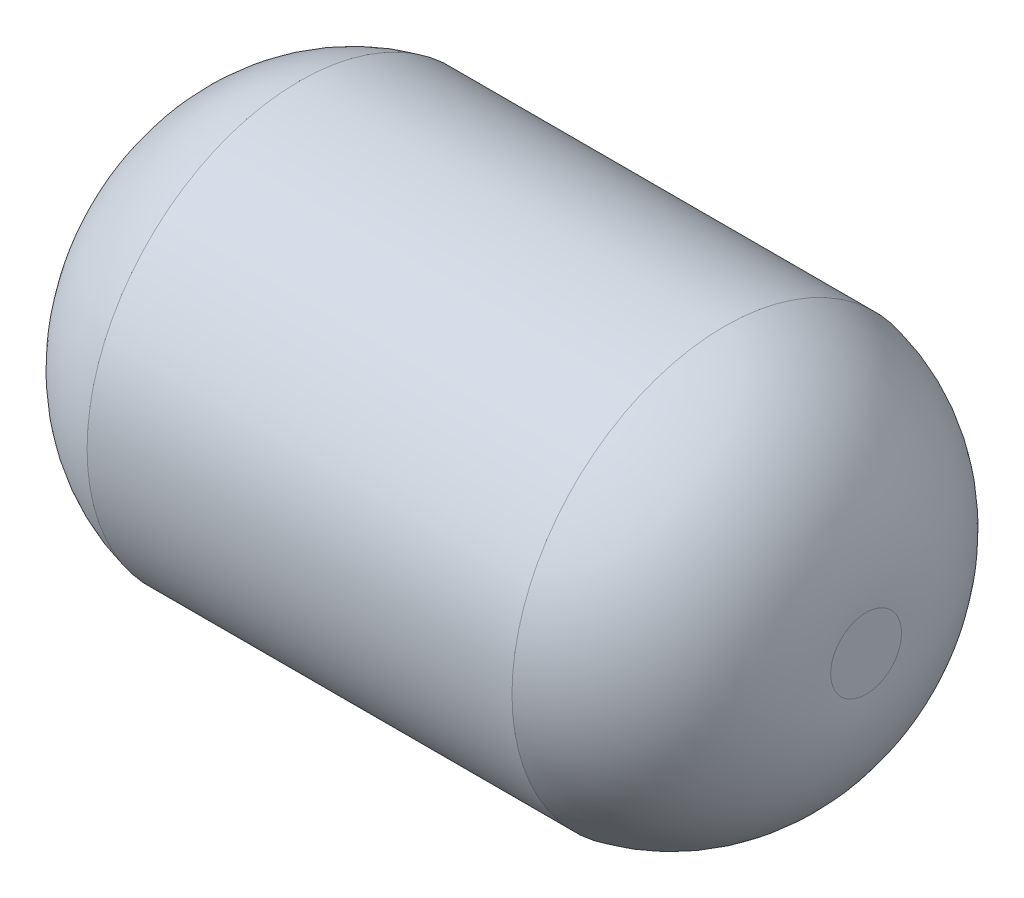
ISO-10303-21;
HEADER;
FILE_DESCRIPTION(('STEP AP214'),'2;1');
FILE_NAME('part.step','',(''),(''),'','','');
FILE_SCHEMA(('AUTOMOTIVE_DESIGN { 1 0 10303 214 1 1 1 1 }'));
ENDSEC;
DATA;
#1=APPLICATION_CONTEXT('core data for automotive mechanical design processes');
#2=APPLICATION_PROTOCOL_DEFINITION('international standard','automotive_design',2000,#1);
#3=PRODUCT_CONTEXT('',#1,'mechanical');
#4=PRODUCT('Part','Part','',(#3));
#5=PRODUCT_RELATED_PRODUCT_CATEGORY('part','',(#4));
#6=PRODUCT_DEFINITION_FORMATION('','',#4);
#7=PRODUCT_DEFINITION_CONTEXT('part definition',#1,'design');
#8=PRODUCT_DEFINITION('design','',#6,#7);
#9=PRODUCT_DEFINITION_SHAPE('','',#8);
#10=(LENGTH_UNIT() NAMED_UNIT(*) SI_UNIT(.MILLI.,.METRE.));
#11=(NAMED_UNIT(*) PLANE_ANGLE_UNIT() SI_UNIT($,.RADIAN.));
#12=(NAMED_UNIT(*) SI_UNIT($,.STERADIAN.) SOLID_ANGLE_UNIT());
#13=UNCERTAINTY_MEASURE_WITH_UNIT(LENGTH_MEASURE(1.E-05),#10,'distance_accuracy_value','');
#14=(GEOMETRIC_REPRESENTATION_CONTEXT(3) GLOBAL_UNCERTAINTY_ASSIGNED_CONTEXT((#13)) GLOBAL_UNIT_ASSIGNED_CONTEXT((#10,
#11,#12)) REPRESENTATION_CONTEXT('',''));
#15=CARTESIAN_POINT('',(0.,0.,0.));
#16=DIRECTION('',(0.,0.,1.));
#17=DIRECTION('',(1.,0.,0.));
#18=AXIS2_PLACEMENT_3D('',#15,#16,#17);
#19=CARTESIAN_POINT('',(0.,0.,0.));
#20=DIRECTION('',(-1.,0.,0.));
#21=DIRECTION('',(0.,0.,1.));
#22=AXIS2_PLACEMENT_3D('',#19,#20,#21);
#23=CYLINDRICAL_SURFACE('',#22,60.);
#24=CARTESIAN_POINT('',(59.9999999999999,0.,0.));
#25=DIRECTION('',(-1.,0.,0.));
#26=DIRECTION('',(0.,0.,1.));
#27=AXIS2_PLACEMENT_3D('',#24,#25,#26);
#28=CIRCLE('',#27,60.);
#29=CARTESIAN_POINT('',(59.9999999999999,0.,60.));
#30=VERTEX_POINT('',#29);
#31=EDGE_CURVE('E48',#30,#30,#28,.T.);
#32=ORIENTED_EDGE('',*,*,#31,.T.);
#33=EDGE_LOOP('',(#32));
#34=FACE_BOUND('',#33,.T.);
#35=CARTESIAN_POINT('',(-59.9999999999999,0.,0.));
#36=DIRECTION('',(-1.,0.,0.));
#37=DIRECTION('',(0.,0.,1.));
#38=AXIS2_PLACEMENT_3D('',#35,#36,#37);
#39=CIRCLE('',#38,60.);
#40=CARTESIAN_POINT('',(-59.9999999999999,0.,60.));
#41=VERTEX_POINT('',#40);
#42=EDGE_CURVE('E62',#41,#41,#39,.T.);
#43=ORIENTED_EDGE('',*,*,#42,.F.);
#44=EDGE_LOOP('',(#43));
#45=FACE_BOUND('',#44,.T.);
#46=ADVANCED_FACE('F33',(#34,#45),#23,.T.);
#47=CARTESIAN_POINT('',(100.,0.,0.));
#48=DIRECTION('',(-1.,0.,0.));
#49=DIRECTION('',(0.,0.,1.));
#50=AXIS2_PLACEMENT_3D('',#47,#48,#49);
#51=PLANE('',#50);
#52=CARTESIAN_POINT('',(100.,0.,0.));
#53=DIRECTION('',(-1.,0.,0.));
#54=DIRECTION('',(0.,0.,1.));
#55=AXIS2_PLACEMENT_3D('',#52,#53,#54);
#56=CIRCLE('',#55,9.99999999999979);
#57=CARTESIAN_POINT('',(100.,0.,9.99999999999979));
#58=VERTEX_POINT('',#57);
#59=EDGE_CURVE('E44',#58,#58,#56,.T.);
#60=ORIENTED_EDGE('',*,*,#59,.F.);
#61=EDGE_LOOP('',(#60));
#62=FACE_BOUND('',#61,.T.);
#63=ADVANCED_FACE('F70',(#62),#51,.F.);
#64=CARTESIAN_POINT('',(49.7390987972272,0.,0.));
#65=DIRECTION('',(-1.,0.,0.));
#66=DIRECTION('',(0.,0.,1.));
#67=AXIS2_PLACEMENT_3D('',#64,#65,#66);
#68=DEGENERATE_TOROIDAL_SURFACE('',#67,10.7912790377818,50.2671295403917,.T.);
#69=ORIENTED_EDGE('',*,*,#31,.F.);
#70=EDGE_LOOP('',(#69));
#71=FACE_BOUND('',#70,.T.);
#72=ORIENTED_EDGE('',*,*,#59,.T.);
#73=EDGE_LOOP('',(#72));
#74=FACE_BOUND('',#73,.T.);
#75=ADVANCED_FACE('F75',(#71,#74),#68,.T.);
#76=CARTESIAN_POINT('',(-100.,0.,0.));
#77=DIRECTION('',(1.,0.,0.));
#78=DIRECTION('',(0.,0.,1.));
#79=AXIS2_PLACEMENT_3D('',#76,#77,#78);
#80=PLANE('',#79);
#81=CARTESIAN_POINT('',(-100.,0.,0.));
#82=DIRECTION('',(-1.,0.,0.));
#83=DIRECTION('',(0.,0.,1.));
#84=AXIS2_PLACEMENT_3D('',#81,#82,#83);
#85=CIRCLE('',#84,9.99999999999979);
#86=CARTESIAN_POINT('',(-100.,0.,9.99999999999979));
#87=VERTEX_POINT('',#86);
#88=EDGE_CURVE('E59',#87,#87,#85,.T.);
#89=ORIENTED_EDGE('',*,*,#88,.T.);
#90=EDGE_LOOP('',(#89));
#91=FACE_BOUND('',#90,.T.);
#92=ADVANCED_FACE('F82',(#91),#80,.F.);
#93=CARTESIAN_POINT('',(-49.7390987972272,0.,0.));
#94=DIRECTION('',(1.,0.,0.));
#95=DIRECTION('',(0.,0.,1.));
#96=AXIS2_PLACEMENT_3D('',#93,#94,#95);
#97=DEGENERATE_TOROIDAL_SURFACE('',#96,10.7912790377818,50.2671295403917,.T.);
#98=ORIENTED_EDGE('',*,*,#42,.T.);
#99=EDGE_LOOP('',(#98));
#100=FACE_BOUND('',#99,.T.);
#101=ORIENTED_EDGE('',*,*,#88,.F.);
#102=EDGE_LOOP('',(#101));
#103=FACE_BOUND('',#102,.T.);
#104=ADVANCED_FACE('F66',(#100,#103),#97,.T.);
#105=CLOSED_SHELL('',(#46,#63,#75,#92,#104));
#106=CARTESIAN_POINT('',(99.,0.,0.));
#107=DIRECTION('',(-1.,0.,0.));
#108=DIRECTION('',(0.,0.,1.));
#109=AXIS2_PLACEMENT_3D('',#106,#107,#108);
#110=PLANE('',#109);
#111=CARTESIAN_POINT('',(99.,0.,0.));
#112=DIRECTION('',(-1.,0.,0.));
#113=DIRECTION('',(0.,0.,1.));
#114=AXIS2_PLACEMENT_3D('',#111,#112,#113);
#115=CIRCLE('',#114,10.0079107716416);
#116=CARTESIAN_POINT('',(99.,0.,10.0079107716416));
#117=VERTEX_POINT('',#116);
#118=EDGE_CURVE('E40',#117,#117,#115,.T.);
#119=ORIENTED_EDGE('',*,*,#118,.T.);
#120=EDGE_LOOP('',(#119));
#121=FACE_BOUND('',#120,.T.);
#122=ADVANCED_FACE('F94',(#121),#110,.T.);
#123=CARTESIAN_POINT('',(49.7390987972272,0.,0.));
#124=DIRECTION('',(-1.,0.,0.));
#125=DIRECTION('',(0.,0.,1.));
#126=AXIS2_PLACEMENT_3D('',#123,#124,#125);
#127=DEGENERATE_TOROIDAL_SURFACE('',#126,10.7912790377818,49.2671295403917,.T.);
#128=CARTESIAN_POINT('',(59.8963265851975,0.,0.));
#129=DIRECTION('',(-1.,0.,0.));
#130=DIRECTION('',(0.,0.,1.));
#131=AXIS2_PLACEMENT_3D('',#128,#129,#130);
#132=CIRCLE('',#131,59.);
#133=CARTESIAN_POINT('',(59.8963265851975,0.,59.));
#134=VERTEX_POINT('',#133);
#135=EDGE_CURVE('E10',#134,#134,#132,.T.);
#136=ORIENTED_EDGE('',*,*,#135,.T.);
#137=EDGE_LOOP('',(#136));
#138=FACE_BOUND('',#137,.T.);
#139=ORIENTED_EDGE('',*,*,#118,.F.);
#140=EDGE_LOOP('',(#139));
#141=FACE_BOUND('',#140,.T.);
#142=ADVANCED_FACE('F97',(#138,#141),#127,.F.);
#143=CARTESIAN_POINT('',(0.,0.,0.));
#144=DIRECTION('',(-1.,0.,0.));
#145=DIRECTION('',(0.,0.,1.));
#146=AXIS2_PLACEMENT_3D('',#143,#144,#145);
#147=CYLINDRICAL_SURFACE('',#146,59.);
#148=ORIENTED_EDGE('',*,*,#135,.F.);
#149=EDGE_LOOP('',(#148));
#150=FACE_BOUND('',#149,.T.);
#151=CARTESIAN_POINT('',(-59.8963265851975,0.,0.));
#152=DIRECTION('',(-1.,0.,0.));
#153=DIRECTION('',(0.,0.,1.));
#154=AXIS2_PLACEMENT_3D('',#151,#152,#153);
#155=CIRCLE('',#154,59.);
#156=CARTESIAN_POINT('',(-59.8963265851975,0.,59.));
#157=VERTEX_POINT('',#156);
#158=EDGE_CURVE('E53',#157,#157,#155,.T.);
#159=ORIENTED_EDGE('',*,*,#158,.T.);
#160=EDGE_LOOP('',(#159));
#161=FACE_BOUND('',#160,.T.);
#162=ADVANCED_FACE('F100',(#150,#161),#147,.F.);
#163=CARTESIAN_POINT('',(-99.,0.,0.));
#164=DIRECTION('',(1.,0.,0.));
#165=DIRECTION('',(0.,0.,1.));
#166=AXIS2_PLACEMENT_3D('',#163,#164,#165);
#167=PLANE('',#166);
#168=CARTESIAN_POINT('',(-99.,0.,0.));
#169=DIRECTION('',(-1.,0.,0.));
#170=DIRECTION('',(0.,0.,1.));
#171=AXIS2_PLACEMENT_3D('',#168,#169,#170);
#172=CIRCLE('',#171,10.0079107716416);
#173=CARTESIAN_POINT('',(-99.,0.,10.0079107716416));
#174=VERTEX_POINT('',#173);
#175=EDGE_CURVE('E56',#174,#174,#172,.T.);
#176=ORIENTED_EDGE('',*,*,#175,.F.);
#177=EDGE_LOOP('',(#176));
#178=FACE_BOUND('',#177,.T.);
#179=ADVANCED_FACE('F102',(#178),#167,.T.);
#180=CARTESIAN_POINT('',(-49.7390987972272,0.,0.));
#181=DIRECTION('',(1.,0.,0.));
#182=DIRECTION('',(0.,0.,1.));
#183=AXIS2_PLACEMENT_3D('',#180,#181,#182);
#184=DEGENERATE_TOROIDAL_SURFACE('',#183,10.7912790377818,49.2671295403917,.T.);
#185=ORIENTED_EDGE('',*,*,#158,.F.);
#186=EDGE_LOOP('',(#185));
#187=FACE_BOUND('',#186,.T.);
#188=ORIENTED_EDGE('',*,*,#175,.T.);
#189=EDGE_LOOP('',(#188));
#190=FACE_BOUND('',#189,.T.);
#191=ADVANCED_FACE('F91',(#187,#190),#184,.F.);
#192=CLOSED_SHELL('',(#122,#142,#162,#179,#191));
#193=ORIENTED_CLOSED_SHELL('',*,#192,.T.);
#194=BREP_WITH_VOIDS('B2',#105,(#193));
#195=ADVANCED_BREP_SHAPE_REPRESENTATION('',(#18,#194),#14);
#196=SHAPE_DEFINITION_REPRESENTATION(#9,#195);
ENDSEC;
END-ISO-10303-21;
